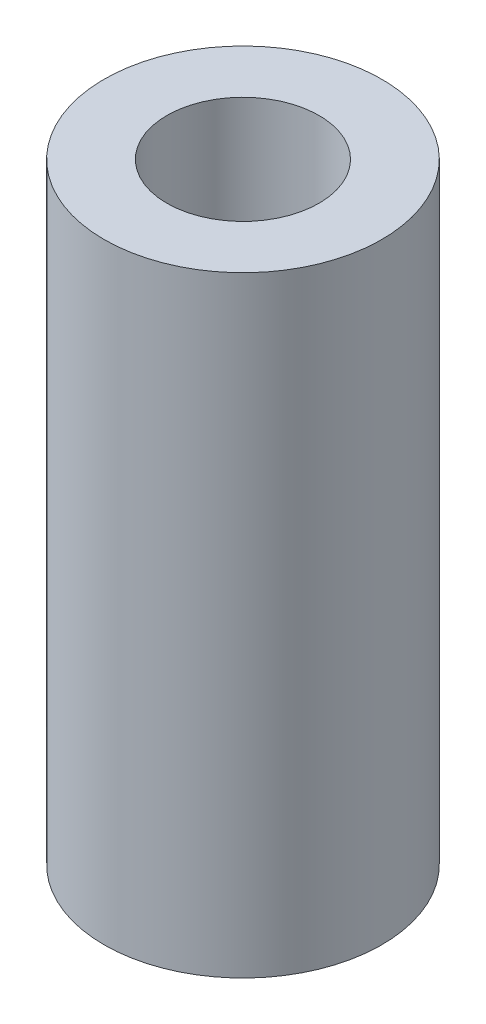
ISO-10303-21;
HEADER;
FILE_DESCRIPTION(('STEP AP214'),'2;1');
FILE_NAME('part.step','',(''),(''),'','','');
FILE_SCHEMA(('AUTOMOTIVE_DESIGN { 1 0 10303 214 1 1 1 1 }'));
ENDSEC;
DATA;
#1=APPLICATION_CONTEXT('core data for automotive mechanical design processes');
#2=APPLICATION_PROTOCOL_DEFINITION('international standard','automotive_design',2000,#1);
#3=PRODUCT_CONTEXT('',#1,'mechanical');
#4=PRODUCT('Part','Part','',(#3));
#5=PRODUCT_RELATED_PRODUCT_CATEGORY('part','',(#4));
#6=PRODUCT_DEFINITION_FORMATION('','',#4);
#7=PRODUCT_DEFINITION_CONTEXT('part definition',#1,'design');
#8=PRODUCT_DEFINITION('design','',#6,#7);
#9=PRODUCT_DEFINITION_SHAPE('','',#8);
#10=(LENGTH_UNIT() NAMED_UNIT(*) SI_UNIT(.MILLI.,.METRE.));
#11=(NAMED_UNIT(*) PLANE_ANGLE_UNIT() SI_UNIT($,.RADIAN.));
#12=(NAMED_UNIT(*) SI_UNIT($,.STERADIAN.) SOLID_ANGLE_UNIT());
#13=UNCERTAINTY_MEASURE_WITH_UNIT(LENGTH_MEASURE(1.E-05),#10,'distance_accuracy_value','');
#14=(GEOMETRIC_REPRESENTATION_CONTEXT(3) GLOBAL_UNCERTAINTY_ASSIGNED_CONTEXT((#13)) GLOBAL_UNIT_ASSIGNED_CONTEXT((#10,
#11,#12)) REPRESENTATION_CONTEXT('',''));
#15=CARTESIAN_POINT('',(0.,0.,0.));
#16=DIRECTION('',(0.,0.,1.));
#17=DIRECTION('',(1.,0.,0.));
#18=AXIS2_PLACEMENT_3D('',#15,#16,#17);
#19=CARTESIAN_POINT('',(0.,45.8977702853718,0.));
#20=DIRECTION('',(0.,-1.,0.));
#21=DIRECTION('',(0.,0.,-1.));
#22=AXIS2_PLACEMENT_3D('',#19,#20,#21);
#23=CYLINDRICAL_SURFACE('',#22,6.35);
#24=CARTESIAN_POINT('',(0.,0.,0.));
#25=DIRECTION('',(0.,1.,0.));
#26=DIRECTION('',(0.,0.,1.));
#27=AXIS2_PLACEMENT_3D('',#24,#25,#26);
#28=CIRCLE('',#27,6.35);
#29=CARTESIAN_POINT('',(0.,0.,6.35));
#30=VERTEX_POINT('',#29);
#31=EDGE_CURVE('E48',#30,#30,#28,.T.);
#32=ORIENTED_EDGE('',*,*,#31,.T.);
#33=EDGE_LOOP('',(#32));
#34=FACE_BOUND('',#33,.T.);
#35=CARTESIAN_POINT('',(0.,27.9372580432335,0.));
#36=DIRECTION('',(0.,1.,0.));
#37=DIRECTION('',(0.,0.,1.));
#38=AXIS2_PLACEMENT_3D('',#35,#36,#37);
#39=CIRCLE('',#38,6.35);
#40=CARTESIAN_POINT('',(0.,27.9372580432335,6.35));
#41=VERTEX_POINT('',#40);
#42=EDGE_CURVE('E10',#41,#41,#39,.T.);
#43=ORIENTED_EDGE('',*,*,#42,.F.);
#44=EDGE_LOOP('',(#43));
#45=FACE_BOUND('',#44,.T.);
#46=ADVANCED_FACE('F41',(#34,#45),#23,.T.);
#47=CARTESIAN_POINT('',(0.,0.,0.));
#48=DIRECTION('',(0.,1.,0.));
#49=DIRECTION('',(0.,0.,1.));
#50=AXIS2_PLACEMENT_3D('',#47,#48,#49);
#51=PLANE('',#50);
#52=ORIENTED_EDGE('',*,*,#31,.F.);
#53=EDGE_LOOP('',(#52));
#54=FACE_BOUND('',#53,.T.);
#55=CARTESIAN_POINT('',(1.20568385136854E-06,0.,3.66345669078338E-08));
#56=DIRECTION('',(0.,1.,0.));
#57=DIRECTION('',(0.,0.,1.));
#58=AXIS2_PLACEMENT_3D('',#55,#56,#57);
#59=CIRCLE('',#58,3.4798);
#60=CARTESIAN_POINT('',(1.20568385136854E-06,0.,3.47980003663457));
#61=VERTEX_POINT('',#60);
#62=EDGE_CURVE('E54',#61,#61,#59,.T.);
#63=ORIENTED_EDGE('',*,*,#62,.T.);
#64=EDGE_LOOP('',(#63));
#65=FACE_BOUND('',#64,.T.);
#66=ADVANCED_FACE('F72',(#54,#65),#51,.F.);
#67=CARTESIAN_POINT('',(1.20568385136854E-06,45.8977702853718,3.66345669078338E-08));
#68=DIRECTION('',(0.,-1.,0.));
#69=DIRECTION('',(0.,0.,-1.));
#70=AXIS2_PLACEMENT_3D('',#67,#68,#69);
#71=CYLINDRICAL_SURFACE('',#70,3.4798);
#72=ORIENTED_EDGE('',*,*,#62,.F.);
#73=EDGE_LOOP('',(#72));
#74=FACE_BOUND('',#73,.T.);
#75=CARTESIAN_POINT('',(1.20568385136854E-06,27.9372580432335,3.66345669078338E-08));
#76=DIRECTION('',(0.,1.,0.));
#77=DIRECTION('',(0.,0.,1.));
#78=AXIS2_PLACEMENT_3D('',#75,#76,#77);
#79=CIRCLE('',#78,3.4798);
#80=CARTESIAN_POINT('',(1.20568385136854E-06,27.9372580432335,3.47980003663457));
#81=VERTEX_POINT('',#80);
#82=EDGE_CURVE('E44',#81,#81,#79,.T.);
#83=ORIENTED_EDGE('',*,*,#82,.T.);
#84=EDGE_LOOP('',(#83));
#85=FACE_BOUND('',#84,.T.);
#86=ADVANCED_FACE('F63',(#74,#85),#71,.F.);
#87=CARTESIAN_POINT('',(-5.87926888691442,27.9372580432335,11.2571836621361));
#88=DIRECTION('',(0.,1.,0.));
#89=DIRECTION('',(0.462934652960451,0.,-0.886392411456905));
#90=AXIS2_PLACEMENT_3D('',#87,#88,#89);
#91=PLANE('',#90);
#92=ORIENTED_EDGE('',*,*,#82,.F.);
#93=EDGE_LOOP('',(#92));
#94=FACE_BOUND('',#93,.T.);
#95=ORIENTED_EDGE('',*,*,#42,.T.);
#96=EDGE_LOOP('',(#95));
#97=FACE_BOUND('',#96,.T.);
#98=ADVANCED_FACE('F65',(#94,#97),#91,.T.);
#99=CLOSED_SHELL('',(#46,#66,#86,#98));
#100=MANIFOLD_SOLID_BREP('B2',#99);
#101=ADVANCED_BREP_SHAPE_REPRESENTATION('',(#18,#100),#14);
#102=SHAPE_DEFINITION_REPRESENTATION(#9,#101);
ENDSEC;
END-ISO-10303-21;
